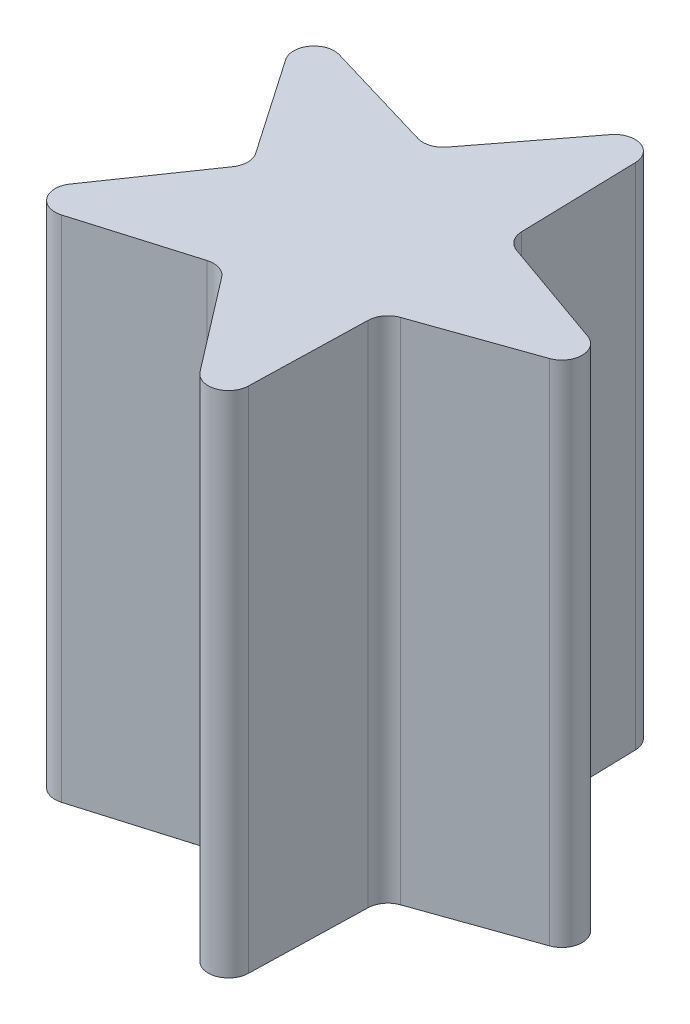
ISO-10303-21;
HEADER;
FILE_DESCRIPTION(('STEP AP214'),'2;1');
FILE_NAME('part.step','',(''),(''),'','','');
FILE_SCHEMA(('AUTOMOTIVE_DESIGN { 1 0 10303 214 1 1 1 1 }'));
ENDSEC;
DATA;
#1=APPLICATION_CONTEXT('core data for automotive mechanical design processes');
#2=APPLICATION_PROTOCOL_DEFINITION('international standard','automotive_design',2000,#1);
#3=PRODUCT_CONTEXT('',#1,'mechanical');
#4=PRODUCT('Part','Part','',(#3));
#5=PRODUCT_RELATED_PRODUCT_CATEGORY('part','',(#4));
#6=PRODUCT_DEFINITION_FORMATION('','',#4);
#7=PRODUCT_DEFINITION_CONTEXT('part definition',#1,'design');
#8=PRODUCT_DEFINITION('design','',#6,#7);
#9=PRODUCT_DEFINITION_SHAPE('','',#8);
#10=(LENGTH_UNIT() NAMED_UNIT(*) SI_UNIT(.MILLI.,.METRE.));
#11=(NAMED_UNIT(*) PLANE_ANGLE_UNIT() SI_UNIT($,.RADIAN.));
#12=(NAMED_UNIT(*) SI_UNIT($,.STERADIAN.) SOLID_ANGLE_UNIT());
#13=UNCERTAINTY_MEASURE_WITH_UNIT(LENGTH_MEASURE(1.E-05),#10,'distance_accuracy_value','');
#14=(GEOMETRIC_REPRESENTATION_CONTEXT(3) GLOBAL_UNCERTAINTY_ASSIGNED_CONTEXT((#13)) GLOBAL_UNIT_ASSIGNED_CONTEXT((#10,
#11,#12)) REPRESENTATION_CONTEXT('',''));
#15=CARTESIAN_POINT('',(0.,0.,0.));
#16=DIRECTION('',(0.,0.,1.));
#17=DIRECTION('',(1.,0.,0.));
#18=AXIS2_PLACEMENT_3D('',#15,#16,#17);
#19=CARTESIAN_POINT('',(-11.3879299942727,-0.000100076,-7.83707047785417));
#20=DIRECTION('',(0.823776107851996,0.,0.566915270681798));
#21=DIRECTION('',(0.566915270681798,0.,-0.823776107851996));
#22=AXIS2_PLACEMENT_3D('',#19,#20,#21);
#23=PLANE('',#22);
#24=DIRECTION('',(0.566915270681798,0.,-0.823776107851996));
#25=VECTOR('',#24,1.);
#26=CARTESIAN_POINT('',(-11.3879299942727,-0.000100076,-7.83707047785417));
#27=LINE('',#26,#25);
#28=CARTESIAN_POINT('',(-26.0389075690663,-0.000100076,13.4520460920266));
#29=VERTEX_POINT('',#28);
#30=CARTESIAN_POINT('',(-17.7723018016981,-0.000100076,1.43996478753178));
#31=VERTEX_POINT('',#30);
#32=EDGE_CURVE('E202',#29,#31,#27,.T.);
#33=ORIENTED_EDGE('',*,*,#32,.F.);
#34=DIRECTION('',(0.,1.,0.));
#35=VECTOR('',#34,1.);
#36=CARTESIAN_POINT('',(-26.0389075690663,-0.000100076,13.4520460920266));
#37=LINE('',#36,#35);
#38=CARTESIAN_POINT('',(-26.0389075690663,63.5,13.4520460920266));
#39=VERTEX_POINT('',#38);
#40=EDGE_CURVE('E186',#29,#39,#37,.T.);
#41=ORIENTED_EDGE('',*,*,#40,.T.);
#42=DIRECTION('',(0.566915270681798,0.,-0.823776107851996));
#43=VECTOR('',#42,1.);
#44=CARTESIAN_POINT('',(-11.3879299942727,63.5,-7.83707047785417));
#45=LINE('',#44,#43);
#46=CARTESIAN_POINT('',(-17.7723018016981,63.5,1.43996478753178));
#47=VERTEX_POINT('',#46);
#48=EDGE_CURVE('E199',#39,#47,#45,.T.);
#49=ORIENTED_EDGE('',*,*,#48,.T.);
#50=DIRECTION('',(0.,1.,0.));
#51=VECTOR('',#50,1.);
#52=CARTESIAN_POINT('',(-17.7723018016981,-0.000100076,1.43996478753178));
#53=LINE('',#52,#51);
#54=EDGE_CURVE('E205',#47,#31,#53,.F.);
#55=ORIENTED_EDGE('',*,*,#54,.T.);
#56=EDGE_LOOP('',(#33,#41,#49,#55));
#57=FACE_BOUND('',#56,.T.);
#58=ADVANCED_FACE('F43',(#57),#23,.F.);
#59=CARTESIAN_POINT('',(-11.3879299942727,-0.000100076,7.83707047785419));
#60=DIRECTION('',(0.823776107851995,0.,-0.5669152706818));
#61=DIRECTION('',(-0.5669152706818,0.,-0.823776107851995));
#62=AXIS2_PLACEMENT_3D('',#59,#60,#61);
#63=PLANE('',#62);
#64=DIRECTION('',(-0.5669152706818,0.,-0.823776107851995));
#65=VECTOR('',#64,1.);
#66=CARTESIAN_POINT('',(-11.3879299942727,-0.000100076,7.83707047785419));
#67=LINE('',#66,#65);
#68=CARTESIAN_POINT('',(-17.7723018016981,-0.000100076,-1.43996478753176));
#69=VERTEX_POINT('',#68);
#70=CARTESIAN_POINT('',(-26.0389075690663,-0.000100076,-13.4520460920265));
#71=VERTEX_POINT('',#70);
#72=EDGE_CURVE('E279',#69,#71,#67,.T.);
#73=ORIENTED_EDGE('',*,*,#72,.F.);
#74=DIRECTION('',(0.,1.,0.));
#75=VECTOR('',#74,1.);
#76=CARTESIAN_POINT('',(-17.7723018016981,63.5,-1.43996478753176));
#77=LINE('',#76,#75);
#78=CARTESIAN_POINT('',(-17.7723018016981,63.5,-1.43996478753176));
#79=VERTEX_POINT('',#78);
#80=EDGE_CURVE('E317',#69,#79,#77,.T.);
#81=ORIENTED_EDGE('',*,*,#80,.T.);
#82=DIRECTION('',(-0.5669152706818,0.,-0.823776107851995));
#83=VECTOR('',#82,1.);
#84=CARTESIAN_POINT('',(-11.3879299942727,63.5,7.83707047785419));
#85=LINE('',#84,#83);
#86=CARTESIAN_POINT('',(-26.0389075690663,63.5,-13.4520460920265));
#87=VERTEX_POINT('',#86);
#88=EDGE_CURVE('E243',#79,#87,#85,.T.);
#89=ORIENTED_EDGE('',*,*,#88,.T.);
#90=DIRECTION('',(0.,1.,0.));
#91=VECTOR('',#90,1.);
#92=CARTESIAN_POINT('',(-26.0389075690663,-0.000100076,-13.4520460920266));
#93=LINE('',#92,#91);
#94=EDGE_CURVE('E314',#87,#71,#93,.F.);
#95=ORIENTED_EDGE('',*,*,#94,.T.);
#96=EDGE_LOOP('',(#73,#81,#89,#95));
#97=FACE_BOUND('',#96,.T.);
#98=ADVANCED_FACE('F425',(#97),#63,.F.);
#99=CARTESIAN_POINT('',(2.8462974767085,-0.000100076,-9.58718535164249));
#100=DIRECTION('',(-0.284607645482839,0.,0.958644088352249));
#101=DIRECTION('',(0.958644088352249,0.,0.284607645482839));
#102=AXIS2_PLACEMENT_3D('',#99,#100,#101);
#103=PLANE('',#102);
#104=DIRECTION('',(0.958644088352249,0.,0.284607645482839));
#105=VECTOR('',#104,1.);
#106=CARTESIAN_POINT('',(2.8462974767085,-0.000100076,-9.58718535164249));
#107=LINE('',#106,#105);
#108=CARTESIAN_POINT('',(-23.2236128355958,-0.000100076,-17.326966863973));
#109=VERTEX_POINT('',#108);
#110=CARTESIAN_POINT('',(-9.24492296877413,-0.000100076,-13.1768948421769));
#111=VERTEX_POINT('',#110);
#112=EDGE_CURVE('E275',#109,#111,#107,.T.);
#113=ORIENTED_EDGE('',*,*,#112,.F.);
#114=DIRECTION('',(0.,1.,0.));
#115=VECTOR('',#114,1.);
#116=CARTESIAN_POINT('',(-23.2236128355958,-0.000100076,-17.326966863973));
#117=LINE('',#116,#115);
#118=CARTESIAN_POINT('',(-23.2236128355958,63.5,-17.326966863973));
#119=VERTEX_POINT('',#118);
#120=EDGE_CURVE('E324',#109,#119,#117,.T.);
#121=ORIENTED_EDGE('',*,*,#120,.T.);
#122=DIRECTION('',(0.958644088352249,0.,0.284607645482839));
#123=VECTOR('',#122,1.);
#124=CARTESIAN_POINT('',(2.8462974767085,63.5,-9.58718535164249));
#125=LINE('',#124,#123);
#126=CARTESIAN_POINT('',(-9.24492296877413,63.5,-13.1768948421769));
#127=VERTEX_POINT('',#126);
#128=EDGE_CURVE('E239',#119,#127,#125,.T.);
#129=ORIENTED_EDGE('',*,*,#128,.T.);
#130=DIRECTION('',(0.,1.,0.));
#131=VECTOR('',#130,1.);
#132=CARTESIAN_POINT('',(-9.24492296877413,-0.000100076,-13.1768948421769));
#133=LINE('',#132,#131);
#134=EDGE_CURVE('E321',#127,#111,#133,.F.);
#135=ORIENTED_EDGE('',*,*,#134,.T.);
#136=EDGE_LOOP('',(#113,#121,#129,#135));
#137=FACE_BOUND('',#136,.T.);
#138=ADVANCED_FACE('F434',(#137),#103,.F.);
#139=CARTESIAN_POINT('',(-10.8902954227724,-0.000100076,-8.34573329453274));
#140=DIRECTION('',(0.793729279255473,0.,0.608271182329549));
#141=DIRECTION('',(0.608271182329549,0.,-0.793729279255473));
#142=AXIS2_PLACEMENT_3D('',#139,#140,#141);
#143=PLANE('',#142);
#144=DIRECTION('',(0.608271182329549,0.,-0.793729279255473));
#145=VECTOR('',#144,1.);
#146=CARTESIAN_POINT('',(-10.8902954227724,-0.000100076,-8.34573329453274));
#147=LINE('',#146,#145);
#148=CARTESIAN_POINT('',(-6.50594717993881,-0.000100076,-14.0668420234745));
#149=VERTEX_POINT('',#148);
#150=CARTESIAN_POINT('',(2.36369935105341,-0.000100076,-25.6407885670757));
#151=VERTEX_POINT('',#150);
#152=EDGE_CURVE('E271',#149,#151,#147,.T.);
#153=ORIENTED_EDGE('',*,*,#152,.F.);
#154=DIRECTION('',(0.,1.,0.));
#155=VECTOR('',#154,1.);
#156=CARTESIAN_POINT('',(-6.50594717993881,63.5,-14.0668420234745));
#157=LINE('',#156,#155);
#158=CARTESIAN_POINT('',(-6.50594717993881,63.5,-14.0668420234745));
#159=VERTEX_POINT('',#158);
#160=EDGE_CURVE('E331',#149,#159,#157,.T.);
#161=ORIENTED_EDGE('',*,*,#160,.T.);
#162=DIRECTION('',(0.608271182329549,0.,-0.793729279255473));
#163=VECTOR('',#162,1.);
#164=CARTESIAN_POINT('',(-10.8902954227724,63.5,-8.34573329453274));
#165=LINE('',#164,#163);
#166=CARTESIAN_POINT('',(2.36369935105341,63.5,-25.6407885670757));
#167=VERTEX_POINT('',#166);
#168=EDGE_CURVE('E235',#159,#167,#165,.T.);
#169=ORIENTED_EDGE('',*,*,#168,.T.);
#170=DIRECTION('',(0.,1.,0.));
#171=VECTOR('',#170,1.);
#172=CARTESIAN_POINT('',(2.36369935105341,-0.000100076,-25.6407885670757));
#173=LINE('',#172,#171);
#174=EDGE_CURVE('E328',#167,#151,#173,.F.);
#175=ORIENTED_EDGE('',*,*,#174,.T.);
#176=EDGE_LOOP('',(#153,#161,#169,#175));
#177=FACE_BOUND('',#176,.T.);
#178=ADVANCED_FACE('F443',(#177),#143,.F.);
#179=CARTESIAN_POINT('',(7.53175218164962,-0.000100076,-0.192569669479797));
#180=DIRECTION('',(-0.999673306218471,0.,0.0255593590340493));
#181=DIRECTION('',(0.0255593590340493,0.,0.999673306218471));
#182=AXIS2_PLACEMENT_3D('',#179,#180,#181);
#183=PLANE('',#182);
#184=DIRECTION('',(0.0255593590340493,0.,0.999673306218471));
#185=VECTOR('',#184,1.);
#186=CARTESIAN_POINT('',(7.53175218164962,-0.000100076,-0.192569669479797));
#187=LINE('',#186,#185);
#188=CARTESIAN_POINT('',(6.91894191815723,-0.000100076,-24.1607005359051));
#189=VERTEX_POINT('',#188);
#190=CARTESIAN_POINT('',(7.29164160667859,-0.000100076,-9.58373366618029));
#191=VERTEX_POINT('',#190);
#192=EDGE_CURVE('E267',#189,#191,#187,.T.);
#193=ORIENTED_EDGE('',*,*,#192,.F.);
#194=DIRECTION('',(0.,1.,0.));
#195=VECTOR('',#194,1.);
#196=CARTESIAN_POINT('',(6.91894191815723,-0.000100076,-24.1607005359051));
#197=LINE('',#196,#195);
#198=CARTESIAN_POINT('',(6.91894191815723,63.5,-24.1607005359051));
#199=VERTEX_POINT('',#198);
#200=EDGE_CURVE('E338',#189,#199,#197,.T.);
#201=ORIENTED_EDGE('',*,*,#200,.T.);
#202=DIRECTION('',(0.0255593590340493,0.,0.999673306218471));
#203=VECTOR('',#202,1.);
#204=CARTESIAN_POINT('',(7.53175218164962,63.5,-0.192569669479797));
#205=LINE('',#204,#203);
#206=CARTESIAN_POINT('',(7.29164160667859,63.5,-9.58373366618029));
#207=VERTEX_POINT('',#206);
#208=EDGE_CURVE('E231',#199,#207,#205,.T.);
#209=ORIENTED_EDGE('',*,*,#208,.T.);
#210=DIRECTION('',(0.,1.,0.));
#211=VECTOR('',#210,1.);
#212=CARTESIAN_POINT('',(7.29164160667859,-0.000100076,-9.58373366618029));
#213=LINE('',#212,#211);
#214=EDGE_CURVE('E335',#207,#191,#213,.F.);
#215=ORIENTED_EDGE('',*,*,#214,.T.);
#216=EDGE_LOOP('',(#193,#201,#209,#215));
#217=FACE_BOUND('',#216,.T.);
#218=ADVANCED_FACE('F452',(#217),#183,.F.);
#219=CARTESIAN_POINT('',(3.27662145609177,-0.000100076,-9.27109220444371));
#220=DIRECTION('',(0.333224435406156,0.,-0.942847535738546));
#221=DIRECTION('',(-0.942847535738546,0.,-0.333224435406156));
#222=AXIS2_PLACEMENT_3D('',#219,#220,#221);
#223=PLANE('',#222);
#224=DIRECTION('',(-0.942847535738546,0.,-0.333224435406156));
#225=VECTOR('',#224,1.);
#226=CARTESIAN_POINT('',(3.27662145609177,-0.000100076,-9.27109220444371));
#227=LINE('',#226,#225);
#228=CARTESIAN_POINT('',(22.7327705302609,-0.000100076,-2.39483274077593));
#229=VERTEX_POINT('',#228);
#230=CARTESIAN_POINT('',(8.98442173854187,-0.000100076,-7.25382169735087));
#231=VERTEX_POINT('',#230);
#232=EDGE_CURVE('E263',#229,#231,#227,.T.);
#233=ORIENTED_EDGE('',*,*,#232,.T.);
#234=DIRECTION('',(0.,1.,0.));
#235=VECTOR('',#234,1.);
#236=CARTESIAN_POINT('',(8.98442173854187,-0.000100076,-7.25382169735087));
#237=LINE('',#236,#235);
#238=CARTESIAN_POINT('',(8.98442173854187,63.5,-7.25382169735087));
#239=VERTEX_POINT('',#238);
#240=EDGE_CURVE('E345',#231,#239,#237,.T.);
#241=ORIENTED_EDGE('',*,*,#240,.T.);
#242=DIRECTION('',(-0.942847535738546,0.,-0.333224435406156));
#243=VECTOR('',#242,1.);
#244=CARTESIAN_POINT('',(3.27662145609177,63.5,-9.27109220444371));
#245=LINE('',#244,#243);
#246=CARTESIAN_POINT('',(22.7327705302609,63.5,-2.39483274077593));
#247=VERTEX_POINT('',#246);
#248=EDGE_CURVE('E227',#247,#239,#245,.T.);
#249=ORIENTED_EDGE('',*,*,#248,.F.);
#250=DIRECTION('',(0.,1.,0.));
#251=VECTOR('',#250,1.);
#252=CARTESIAN_POINT('',(22.7327705302609,-0.000100076,-2.39483274077593));
#253=LINE('',#252,#251);
#254=EDGE_CURVE('E342',#247,#229,#253,.F.);
#255=ORIENTED_EDGE('',*,*,#254,.T.);
#256=EDGE_LOOP('',(#233,#241,#249,#255));
#257=FACE_BOUND('',#256,.T.);
#258=ADVANCED_FACE('F461',(#257),#223,.T.);
#259=CARTESIAN_POINT('',(3.27662145609178,-0.000100076,9.27109220444369));
#260=DIRECTION('',(-0.333224435406158,0.,-0.942847535738545));
#261=DIRECTION('',(-0.942847535738545,0.,0.333224435406158));
#262=AXIS2_PLACEMENT_3D('',#259,#260,#261);
#263=PLANE('',#262);
#264=DIRECTION('',(-0.942847535738545,0.,0.333224435406158));
#265=VECTOR('',#264,1.);
#266=CARTESIAN_POINT('',(3.27662145609178,-0.000100076,9.27109220444369));
#267=LINE('',#266,#265);
#268=CARTESIAN_POINT('',(22.7327705302609,-0.000100076,2.39483274077588));
#269=VERTEX_POINT('',#268);
#270=CARTESIAN_POINT('',(8.98442173854189,-0.000100076,7.25382169735084));
#271=VERTEX_POINT('',#270);
#272=EDGE_CURVE('E259',#269,#271,#267,.T.);
#273=ORIENTED_EDGE('',*,*,#272,.F.);
#274=DIRECTION('',(0.,1.,0.));
#275=VECTOR('',#274,1.);
#276=CARTESIAN_POINT('',(22.7327705302609,63.5,2.39483274077588));
#277=LINE('',#276,#275);
#278=CARTESIAN_POINT('',(22.7327705302609,63.5,2.39483274077588));
#279=VERTEX_POINT('',#278);
#280=EDGE_CURVE('E352',#269,#279,#277,.T.);
#281=ORIENTED_EDGE('',*,*,#280,.T.);
#282=DIRECTION('',(-0.942847535738545,0.,0.333224435406158));
#283=VECTOR('',#282,1.);
#284=CARTESIAN_POINT('',(3.27662145609178,63.5,9.27109220444369));
#285=LINE('',#284,#283);
#286=CARTESIAN_POINT('',(8.98442173854189,63.5,7.25382169735084));
#287=VERTEX_POINT('',#286);
#288=EDGE_CURVE('E223',#279,#287,#285,.T.);
#289=ORIENTED_EDGE('',*,*,#288,.T.);
#290=DIRECTION('',(0.,1.,0.));
#291=VECTOR('',#290,1.);
#292=CARTESIAN_POINT('',(8.98442173854189,-0.000100076,7.25382169735084));
#293=LINE('',#292,#291);
#294=EDGE_CURVE('E349',#287,#271,#293,.F.);
#295=ORIENTED_EDGE('',*,*,#294,.T.);
#296=EDGE_LOOP('',(#273,#281,#289,#295));
#297=FACE_BOUND('',#296,.T.);
#298=ADVANCED_FACE('F399',(#297),#263,.F.);
#299=CARTESIAN_POINT('',(7.53175218164961,-0.000100076,0.192569669479776));
#300=DIRECTION('',(-0.999673306218471,0.,-0.0255593590340466));
#301=DIRECTION('',(-0.0255593590340466,0.,0.999673306218471));
#302=AXIS2_PLACEMENT_3D('',#299,#300,#301);
#303=PLANE('',#302);
#304=DIRECTION('',(-0.0255593590340466,0.,0.999673306218471));
#305=VECTOR('',#304,1.);
#306=CARTESIAN_POINT('',(7.53175218164961,-0.000100076,0.192569669479776));
#307=LINE('',#306,#305);
#308=CARTESIAN_POINT('',(7.29164160667861,-0.000100076,9.58373366618026));
#309=VERTEX_POINT('',#308);
#310=CARTESIAN_POINT('',(6.91894191815729,-0.000100076,24.1607005359051));
#311=VERTEX_POINT('',#310);
#312=EDGE_CURVE('E256',#309,#311,#307,.T.);
#313=ORIENTED_EDGE('',*,*,#312,.F.);
#314=DIRECTION('',(0.,1.,0.));
#315=VECTOR('',#314,1.);
#316=CARTESIAN_POINT('',(7.29164160667861,63.5,9.58373366618026));
#317=LINE('',#316,#315);
#318=CARTESIAN_POINT('',(7.29164160667861,63.5,9.58373366618026));
#319=VERTEX_POINT('',#318);
#320=EDGE_CURVE('E365',#309,#319,#317,.T.);
#321=ORIENTED_EDGE('',*,*,#320,.T.);
#322=DIRECTION('',(-0.0255593590340466,0.,0.999673306218471));
#323=VECTOR('',#322,1.);
#324=CARTESIAN_POINT('',(7.53175218164961,63.5,0.192569669479776));
#325=LINE('',#324,#323);
#326=CARTESIAN_POINT('',(6.91894191815729,63.5,24.1607005359051));
#327=VERTEX_POINT('',#326);
#328=EDGE_CURVE('E219',#319,#327,#325,.T.);
#329=ORIENTED_EDGE('',*,*,#328,.T.);
#330=DIRECTION('',(0.,1.,0.));
#331=VECTOR('',#330,1.);
#332=CARTESIAN_POINT('',(6.91894191815729,-0.000100076,24.1607005359051));
#333=LINE('',#332,#331);
#334=EDGE_CURVE('E362',#327,#311,#333,.F.);
#335=ORIENTED_EDGE('',*,*,#334,.T.);
#336=EDGE_LOOP('',(#313,#321,#329,#335));
#337=FACE_BOUND('',#336,.T.);
#338=ADVANCED_FACE('F406',(#337),#303,.F.);
#339=CARTESIAN_POINT('',(-10.8902954227724,-0.000100076,8.34573329453276));
#340=DIRECTION('',(0.793729279255471,0.,-0.608271182329551));
#341=DIRECTION('',(-0.608271182329551,0.,-0.793729279255472));
#342=AXIS2_PLACEMENT_3D('',#339,#340,#341);
#343=PLANE('',#342);
#344=DIRECTION('',(-0.608271182329551,0.,-0.793729279255472));
#345=VECTOR('',#344,1.);
#346=CARTESIAN_POINT('',(-10.8902954227724,63.5,8.34573329453276));
#347=LINE('',#346,#345);
#348=CARTESIAN_POINT('',(2.36369935105349,63.5,25.6407885670757));
#349=VERTEX_POINT('',#348);
#350=CARTESIAN_POINT('',(-6.50594717993878,63.5,14.0668420234746));
#351=VERTEX_POINT('',#350);
#352=EDGE_CURVE('E214',#349,#351,#347,.T.);
#353=ORIENTED_EDGE('',*,*,#352,.T.);
#354=DIRECTION('',(0.,1.,0.));
#355=VECTOR('',#354,1.);
#356=CARTESIAN_POINT('',(-6.50594717993878,-0.000100076,14.0668420234746));
#357=LINE('',#356,#355);
#358=CARTESIAN_POINT('',(-6.50594717993878,-0.000100076,14.0668420234746));
#359=VERTEX_POINT('',#358);
#360=EDGE_CURVE('E59',#351,#359,#357,.F.);
#361=ORIENTED_EDGE('',*,*,#360,.T.);
#362=DIRECTION('',(-0.608271182329551,0.,-0.793729279255472));
#363=VECTOR('',#362,1.);
#364=CARTESIAN_POINT('',(-10.8902954227724,-0.000100076,8.34573329453276));
#365=LINE('',#364,#363);
#366=CARTESIAN_POINT('',(2.36369935105349,-0.000100076,25.6407885670757));
#367=VERTEX_POINT('',#366);
#368=EDGE_CURVE('E253',#367,#359,#365,.T.);
#369=ORIENTED_EDGE('',*,*,#368,.F.);
#370=DIRECTION('',(0.,1.,0.));
#371=VECTOR('',#370,1.);
#372=CARTESIAN_POINT('',(2.36369935105348,-0.000100076,25.6407885670757));
#373=LINE('',#372,#371);
#374=EDGE_CURVE('E356',#367,#349,#373,.T.);
#375=ORIENTED_EDGE('',*,*,#374,.T.);
#376=EDGE_LOOP('',(#353,#361,#369,#375));
#377=FACE_BOUND('',#376,.T.);
#378=ADVANCED_FACE('F411',(#377),#343,.F.);
#379=CARTESIAN_POINT('',(2.84629747670852,-0.000100076,9.58718535164248));
#380=DIRECTION('',(-0.284607645482841,0.,-0.958644088352249));
#381=DIRECTION('',(-0.958644088352249,0.,0.284607645482841));
#382=AXIS2_PLACEMENT_3D('',#379,#380,#381);
#383=PLANE('',#382);
#384=DIRECTION('',(-0.958644088352249,0.,0.284607645482841));
#385=VECTOR('',#384,1.);
#386=CARTESIAN_POINT('',(2.84629747670852,63.5,9.58718535164248));
#387=LINE('',#386,#385);
#388=CARTESIAN_POINT('',(-9.24492296877409,63.5,13.1768948421769));
#389=VERTEX_POINT('',#388);
#390=CARTESIAN_POINT('',(-23.2236128355958,63.5,17.3269668639731));
#391=VERTEX_POINT('',#390);
#392=EDGE_CURVE('E211',#389,#391,#387,.T.);
#393=ORIENTED_EDGE('',*,*,#392,.T.);
#394=DIRECTION('',(0.,1.,0.));
#395=VECTOR('',#394,1.);
#396=CARTESIAN_POINT('',(-23.2236128355958,-0.000100076,17.3269668639731));
#397=LINE('',#396,#395);
#398=CARTESIAN_POINT('',(-23.2236128355958,-0.000100076,17.3269668639731));
#399=VERTEX_POINT('',#398);
#400=EDGE_CURVE('E187',#391,#399,#397,.F.);
#401=ORIENTED_EDGE('',*,*,#400,.T.);
#402=DIRECTION('',(-0.958644088352249,0.,0.284607645482841));
#403=VECTOR('',#402,1.);
#404=CARTESIAN_POINT('',(2.84629747670852,-0.000100076,9.58718535164248));
#405=LINE('',#404,#403);
#406=CARTESIAN_POINT('',(-9.24492296877409,-0.000100076,13.1768948421769));
#407=VERTEX_POINT('',#406);
#408=EDGE_CURVE('E249',#407,#399,#405,.T.);
#409=ORIENTED_EDGE('',*,*,#408,.F.);
#410=DIRECTION('',(0.,1.,0.));
#411=VECTOR('',#410,1.);
#412=CARTESIAN_POINT('',(-9.24492296877409,63.5,13.1768948421769));
#413=LINE('',#412,#411);
#414=EDGE_CURVE('E193',#407,#389,#413,.T.);
#415=ORIENTED_EDGE('',*,*,#414,.T.);
#416=EDGE_LOOP('',(#393,#401,#409,#415));
#417=FACE_BOUND('',#416,.T.);
#418=ADVANCED_FACE('F418',(#417),#383,.F.);
#419=CARTESIAN_POINT('',(0.,-0.000100076,0.));
#420=DIRECTION('',(0.,1.,0.));
#421=DIRECTION('',(0.,0.,1.));
#422=AXIS2_PLACEMENT_3D('',#419,#420,#421);
#423=PLANE('',#422);
#424=ORIENTED_EDGE('',*,*,#408,.T.);
#425=CARTESIAN_POINT('',(-23.9465162551222,-0.000100076,14.8920108795584));
#426=DIRECTION('',(0.,1.,0.));
#427=DIRECTION('',(0.,0.,1.));
#428=AXIS2_PLACEMENT_3D('',#425,#426,#427);
#429=CIRCLE('',#428,2.54);
#430=EDGE_CURVE('E311',#399,#29,#429,.F.);
#431=ORIENTED_EDGE('',*,*,#430,.T.);
#432=ORIENTED_EDGE('',*,*,#32,.T.);
#433=CARTESIAN_POINT('',(-19.8646931156421,-0.000100076,0.));
#434=DIRECTION('',(0.,1.,0.));
#435=DIRECTION('',(0.,0.,1.));
#436=AXIS2_PLACEMENT_3D('',#433,#434,#435);
#437=CIRCLE('',#436,2.54);
#438=EDGE_CURVE('E371',#31,#69,#437,.T.);
#439=ORIENTED_EDGE('',*,*,#438,.T.);
#440=ORIENTED_EDGE('',*,*,#72,.T.);
#441=CARTESIAN_POINT('',(-23.9465162551222,-0.000100076,-14.8920108795583));
#442=DIRECTION('',(0.,1.,0.));
#443=DIRECTION('',(0.,0.,1.));
#444=AXIS2_PLACEMENT_3D('',#441,#442,#443);
#445=CIRCLE('',#444,2.54);
#446=EDGE_CURVE('E308',#71,#109,#445,.F.);
#447=ORIENTED_EDGE('',*,*,#446,.T.);
#448=ORIENTED_EDGE('',*,*,#112,.T.);
#449=CARTESIAN_POINT('',(-8.52201954924772,-0.000100076,-15.6118508265916));
#450=DIRECTION('',(0.,1.,0.));
#451=DIRECTION('',(0.,0.,1.));
#452=AXIS2_PLACEMENT_3D('',#449,#450,#451);
#453=CIRCLE('',#452,2.54);
#454=EDGE_CURVE('E377',#111,#149,#453,.T.);
#455=ORIENTED_EDGE('',*,*,#454,.T.);
#456=ORIENTED_EDGE('',*,*,#152,.T.);
#457=CARTESIAN_POINT('',(4.37977172036232,-0.000100076,-24.0957797639586));
#458=DIRECTION('',(0.,1.,0.));
#459=DIRECTION('',(0.,0.,1.));
#460=AXIS2_PLACEMENT_3D('',#457,#458,#459);
#461=CIRCLE('',#460,2.54);
#462=EDGE_CURVE('E305',#151,#189,#461,.F.);
#463=ORIENTED_EDGE('',*,*,#462,.T.);
#464=ORIENTED_EDGE('',*,*,#192,.T.);
#465=CARTESIAN_POINT('',(9.8308118044735,-0.000100076,-9.64865443812677));
#466=DIRECTION('',(0.,1.,0.));
#467=DIRECTION('',(0.,0.,1.));
#468=AXIS2_PLACEMENT_3D('',#465,#466,#467);
#469=CIRCLE('',#468,2.54);
#470=EDGE_CURVE('E383',#191,#231,#469,.T.);
#471=ORIENTED_EDGE('',*,*,#470,.T.);
#472=ORIENTED_EDGE('',*,*,#232,.F.);
#473=CARTESIAN_POINT('',(21.8863804643293,-0.000100076,0.));
#474=DIRECTION('',(0.,1.,0.));
#475=DIRECTION('',(0.,0.,1.));
#476=AXIS2_PLACEMENT_3D('',#473,#474,#475);
#477=CIRCLE('',#476,2.54);
#478=EDGE_CURVE('E302',#229,#269,#477,.F.);
#479=ORIENTED_EDGE('',*,*,#478,.T.);
#480=ORIENTED_EDGE('',*,*,#272,.T.);
#481=CARTESIAN_POINT('',(9.83081180447353,-0.000100076,9.64865443812674));
#482=DIRECTION('',(0.,1.,0.));
#483=DIRECTION('',(0.,0.,1.));
#484=AXIS2_PLACEMENT_3D('',#481,#482,#483);
#485=CIRCLE('',#484,2.54);
#486=EDGE_CURVE('E11',#271,#309,#485,.T.);
#487=ORIENTED_EDGE('',*,*,#486,.T.);
#488=ORIENTED_EDGE('',*,*,#312,.T.);
#489=CARTESIAN_POINT('',(4.37977172036238,-0.000100076,24.0957797639586));
#490=DIRECTION('',(0.,1.,0.));
#491=DIRECTION('',(0.,0.,1.));
#492=AXIS2_PLACEMENT_3D('',#489,#490,#491);
#493=CIRCLE('',#492,2.54);
#494=EDGE_CURVE('E66',#311,#367,#493,.F.);
#495=ORIENTED_EDGE('',*,*,#494,.T.);
#496=ORIENTED_EDGE('',*,*,#368,.T.);
#497=CARTESIAN_POINT('',(-8.52201954924768,-0.000100076,15.6118508265916));
#498=DIRECTION('',(0.,1.,0.));
#499=DIRECTION('',(0.,0.,1.));
#500=AXIS2_PLACEMENT_3D('',#497,#498,#499);
#501=CIRCLE('',#500,2.54);
#502=EDGE_CURVE('E389',#359,#407,#501,.T.);
#503=ORIENTED_EDGE('',*,*,#502,.T.);
#504=EDGE_LOOP('',(#424,#431,#432,#439,#440,#447,#448,#455,#456,#463,#464,#471,#472,#479,#480,
#487,#488,#495,#496,#503));
#505=FACE_BOUND('',#504,.T.);
#506=ADVANCED_FACE('F404',(#505),#423,.F.);
#507=CARTESIAN_POINT('',(0.,63.5,0.));
#508=DIRECTION('',(0.,1.,0.));
#509=DIRECTION('',(0.,0.,1.));
#510=AXIS2_PLACEMENT_3D('',#507,#508,#509);
#511=PLANE('',#510);
#512=ORIENTED_EDGE('',*,*,#48,.F.);
#513=CARTESIAN_POINT('',(-23.9465162551222,63.5,14.8920108795584));
#514=DIRECTION('',(0.,1.,0.));
#515=DIRECTION('',(0.,0.,1.));
#516=AXIS2_PLACEMENT_3D('',#513,#514,#515);
#517=CIRCLE('',#516,2.54);
#518=EDGE_CURVE('E182',#39,#391,#517,.T.);
#519=ORIENTED_EDGE('',*,*,#518,.T.);
#520=ORIENTED_EDGE('',*,*,#392,.F.);
#521=CARTESIAN_POINT('',(-8.52201954924768,63.5,15.6118508265916));
#522=DIRECTION('',(0.,1.,0.));
#523=DIRECTION('',(0.,0.,1.));
#524=AXIS2_PLACEMENT_3D('',#521,#522,#523);
#525=CIRCLE('',#524,2.54);
#526=EDGE_CURVE('E386',#389,#351,#525,.F.);
#527=ORIENTED_EDGE('',*,*,#526,.T.);
#528=ORIENTED_EDGE('',*,*,#352,.F.);
#529=CARTESIAN_POINT('',(4.37977172036238,63.5,24.0957797639586));
#530=DIRECTION('',(0.,1.,0.));
#531=DIRECTION('',(0.,0.,1.));
#532=AXIS2_PLACEMENT_3D('',#529,#530,#531);
#533=CIRCLE('',#532,2.54);
#534=EDGE_CURVE('E204',#349,#327,#533,.T.);
#535=ORIENTED_EDGE('',*,*,#534,.T.);
#536=ORIENTED_EDGE('',*,*,#328,.F.);
#537=CARTESIAN_POINT('',(9.83081180447353,63.5,9.64865443812674));
#538=DIRECTION('',(0.,1.,0.));
#539=DIRECTION('',(0.,0.,1.));
#540=AXIS2_PLACEMENT_3D('',#537,#538,#539);
#541=CIRCLE('',#540,2.54);
#542=EDGE_CURVE('E52',#319,#287,#541,.F.);
#543=ORIENTED_EDGE('',*,*,#542,.T.);
#544=ORIENTED_EDGE('',*,*,#288,.F.);
#545=CARTESIAN_POINT('',(21.8863804643293,63.5,0.));
#546=DIRECTION('',(0.,1.,0.));
#547=DIRECTION('',(0.,0.,1.));
#548=AXIS2_PLACEMENT_3D('',#545,#546,#547);
#549=CIRCLE('',#548,2.54);
#550=EDGE_CURVE('E287',#279,#247,#549,.T.);
#551=ORIENTED_EDGE('',*,*,#550,.T.);
#552=ORIENTED_EDGE('',*,*,#248,.T.);
#553=CARTESIAN_POINT('',(9.8308118044735,63.5,-9.64865443812677));
#554=DIRECTION('',(0.,1.,0.));
#555=DIRECTION('',(0.,0.,1.));
#556=AXIS2_PLACEMENT_3D('',#553,#554,#555);
#557=CIRCLE('',#556,2.54);
#558=EDGE_CURVE('E380',#239,#207,#557,.F.);
#559=ORIENTED_EDGE('',*,*,#558,.T.);
#560=ORIENTED_EDGE('',*,*,#208,.F.);
#561=CARTESIAN_POINT('',(4.37977172036232,63.5,-24.0957797639586));
#562=DIRECTION('',(0.,1.,0.));
#563=DIRECTION('',(0.,0.,1.));
#564=AXIS2_PLACEMENT_3D('',#561,#562,#563);
#565=CIRCLE('',#564,2.54);
#566=EDGE_CURVE('E290',#199,#167,#565,.T.);
#567=ORIENTED_EDGE('',*,*,#566,.T.);
#568=ORIENTED_EDGE('',*,*,#168,.F.);
#569=CARTESIAN_POINT('',(-8.52201954924772,63.5,-15.6118508265916));
#570=DIRECTION('',(0.,1.,0.));
#571=DIRECTION('',(0.,0.,1.));
#572=AXIS2_PLACEMENT_3D('',#569,#570,#571);
#573=CIRCLE('',#572,2.54);
#574=EDGE_CURVE('E374',#159,#127,#573,.F.);
#575=ORIENTED_EDGE('',*,*,#574,.T.);
#576=ORIENTED_EDGE('',*,*,#128,.F.);
#577=CARTESIAN_POINT('',(-23.9465162551222,63.5,-14.8920108795583));
#578=DIRECTION('',(0.,1.,0.));
#579=DIRECTION('',(0.,0.,1.));
#580=AXIS2_PLACEMENT_3D('',#577,#578,#579);
#581=CIRCLE('',#580,2.54);
#582=EDGE_CURVE('E194',#119,#87,#581,.T.);
#583=ORIENTED_EDGE('',*,*,#582,.T.);
#584=ORIENTED_EDGE('',*,*,#88,.F.);
#585=CARTESIAN_POINT('',(-19.8646931156421,63.5,0.));
#586=DIRECTION('',(0.,1.,0.));
#587=DIRECTION('',(0.,0.,1.));
#588=AXIS2_PLACEMENT_3D('',#585,#586,#587);
#589=CIRCLE('',#588,2.54);
#590=EDGE_CURVE('E209',#79,#47,#589,.F.);
#591=ORIENTED_EDGE('',*,*,#590,.T.);
#592=EDGE_LOOP('',(#512,#519,#520,#527,#528,#535,#536,#543,#544,#551,#552,#559,#560,#567,#568,
#575,#576,#583,#584,#591));
#593=FACE_BOUND('',#592,.T.);
#594=ADVANCED_FACE('F207',(#593),#511,.T.);
#595=CARTESIAN_POINT('',(-23.9465162551222,-0.000100076,14.8920108795584));
#596=DIRECTION('',(0.,1.,0.));
#597=DIRECTION('',(0.,0.,1.));
#598=AXIS2_PLACEMENT_3D('',#595,#596,#597);
#599=CYLINDRICAL_SURFACE('',#598,2.54);
#600=ORIENTED_EDGE('',*,*,#430,.F.);
#601=ORIENTED_EDGE('',*,*,#400,.F.);
#602=ORIENTED_EDGE('',*,*,#518,.F.);
#603=ORIENTED_EDGE('',*,*,#40,.F.);
#604=EDGE_LOOP('',(#600,#601,#602,#603));
#605=FACE_BOUND('',#604,.T.);
#606=ADVANCED_FACE('F185',(#605),#599,.T.);
#607=CARTESIAN_POINT('',(-19.8646931156421,-0.000100076,0.));
#608=DIRECTION('',(0.,-1.,0.));
#609=DIRECTION('',(0.,0.,-1.));
#610=AXIS2_PLACEMENT_3D('',#607,#608,#609);
#611=CYLINDRICAL_SURFACE('',#610,2.54);
#612=ORIENTED_EDGE('',*,*,#438,.F.);
#613=ORIENTED_EDGE('',*,*,#54,.F.);
#614=ORIENTED_EDGE('',*,*,#590,.F.);
#615=ORIENTED_EDGE('',*,*,#80,.F.);
#616=EDGE_LOOP('',(#612,#613,#614,#615));
#617=FACE_BOUND('',#616,.T.);
#618=ADVANCED_FACE('F423',(#617),#611,.F.);
#619=CARTESIAN_POINT('',(-23.9465162551222,-0.000100076,-14.8920108795583));
#620=DIRECTION('',(0.,1.,0.));
#621=DIRECTION('',(0.,0.,1.));
#622=AXIS2_PLACEMENT_3D('',#619,#620,#621);
#623=CYLINDRICAL_SURFACE('',#622,2.54);
#624=ORIENTED_EDGE('',*,*,#446,.F.);
#625=ORIENTED_EDGE('',*,*,#94,.F.);
#626=ORIENTED_EDGE('',*,*,#582,.F.);
#627=ORIENTED_EDGE('',*,*,#120,.F.);
#628=EDGE_LOOP('',(#624,#625,#626,#627));
#629=FACE_BOUND('',#628,.T.);
#630=ADVANCED_FACE('F431',(#629),#623,.T.);
#631=CARTESIAN_POINT('',(-8.52201954924772,-0.000100076,-15.6118508265916));
#632=DIRECTION('',(0.,-1.,0.));
#633=DIRECTION('',(0.,0.,-1.));
#634=AXIS2_PLACEMENT_3D('',#631,#632,#633);
#635=CYLINDRICAL_SURFACE('',#634,2.54);
#636=ORIENTED_EDGE('',*,*,#454,.F.);
#637=ORIENTED_EDGE('',*,*,#134,.F.);
#638=ORIENTED_EDGE('',*,*,#574,.F.);
#639=ORIENTED_EDGE('',*,*,#160,.F.);
#640=EDGE_LOOP('',(#636,#637,#638,#639));
#641=FACE_BOUND('',#640,.T.);
#642=ADVANCED_FACE('F440',(#641),#635,.F.);
#643=CARTESIAN_POINT('',(4.37977172036232,-0.000100076,-24.0957797639586));
#644=DIRECTION('',(0.,1.,0.));
#645=DIRECTION('',(0.,0.,1.));
#646=AXIS2_PLACEMENT_3D('',#643,#644,#645);
#647=CYLINDRICAL_SURFACE('',#646,2.54);
#648=ORIENTED_EDGE('',*,*,#462,.F.);
#649=ORIENTED_EDGE('',*,*,#174,.F.);
#650=ORIENTED_EDGE('',*,*,#566,.F.);
#651=ORIENTED_EDGE('',*,*,#200,.F.);
#652=EDGE_LOOP('',(#648,#649,#650,#651));
#653=FACE_BOUND('',#652,.T.);
#654=ADVANCED_FACE('F449',(#653),#647,.T.);
#655=CARTESIAN_POINT('',(9.8308118044735,-0.000100076,-9.64865443812677));
#656=DIRECTION('',(0.,1.,0.));
#657=DIRECTION('',(0.,0.,1.));
#658=AXIS2_PLACEMENT_3D('',#655,#656,#657);
#659=CYLINDRICAL_SURFACE('',#658,2.54);
#660=ORIENTED_EDGE('',*,*,#470,.F.);
#661=ORIENTED_EDGE('',*,*,#214,.F.);
#662=ORIENTED_EDGE('',*,*,#558,.F.);
#663=ORIENTED_EDGE('',*,*,#240,.F.);
#664=EDGE_LOOP('',(#660,#661,#662,#663));
#665=FACE_BOUND('',#664,.T.);
#666=ADVANCED_FACE('F458',(#665),#659,.F.);
#667=CARTESIAN_POINT('',(21.8863804643293,-0.000100076,0.));
#668=DIRECTION('',(0.,-1.,0.));
#669=DIRECTION('',(0.,0.,-1.));
#670=AXIS2_PLACEMENT_3D('',#667,#668,#669);
#671=CYLINDRICAL_SURFACE('',#670,2.54);
#672=ORIENTED_EDGE('',*,*,#478,.F.);
#673=ORIENTED_EDGE('',*,*,#254,.F.);
#674=ORIENTED_EDGE('',*,*,#550,.F.);
#675=ORIENTED_EDGE('',*,*,#280,.F.);
#676=EDGE_LOOP('',(#672,#673,#674,#675));
#677=FACE_BOUND('',#676,.T.);
#678=ADVANCED_FACE('F465',(#677),#671,.T.);
#679=CARTESIAN_POINT('',(-8.52201954924768,-0.000100076,15.6118508265916));
#680=DIRECTION('',(0.,-1.,0.));
#681=DIRECTION('',(0.,0.,-1.));
#682=AXIS2_PLACEMENT_3D('',#679,#680,#681);
#683=CYLINDRICAL_SURFACE('',#682,2.54);
#684=ORIENTED_EDGE('',*,*,#502,.F.);
#685=ORIENTED_EDGE('',*,*,#360,.F.);
#686=ORIENTED_EDGE('',*,*,#526,.F.);
#687=ORIENTED_EDGE('',*,*,#414,.F.);
#688=EDGE_LOOP('',(#684,#685,#686,#687));
#689=FACE_BOUND('',#688,.T.);
#690=ADVANCED_FACE('F415',(#689),#683,.F.);
#691=CARTESIAN_POINT('',(9.83081180447353,-0.000100076,9.64865443812674));
#692=DIRECTION('',(0.,-1.,0.));
#693=DIRECTION('',(0.,0.,-1.));
#694=AXIS2_PLACEMENT_3D('',#691,#692,#693);
#695=CYLINDRICAL_SURFACE('',#694,2.54);
#696=ORIENTED_EDGE('',*,*,#486,.F.);
#697=ORIENTED_EDGE('',*,*,#294,.F.);
#698=ORIENTED_EDGE('',*,*,#542,.F.);
#699=ORIENTED_EDGE('',*,*,#320,.F.);
#700=EDGE_LOOP('',(#696,#697,#698,#699));
#701=FACE_BOUND('',#700,.T.);
#702=ADVANCED_FACE('F402',(#701),#695,.F.);
#703=CARTESIAN_POINT('',(4.37977172036238,-0.000100076,24.0957797639586));
#704=DIRECTION('',(0.,1.,0.));
#705=DIRECTION('',(0.,0.,1.));
#706=AXIS2_PLACEMENT_3D('',#703,#704,#705);
#707=CYLINDRICAL_SURFACE('',#706,2.54);
#708=ORIENTED_EDGE('',*,*,#494,.F.);
#709=ORIENTED_EDGE('',*,*,#334,.F.);
#710=ORIENTED_EDGE('',*,*,#534,.F.);
#711=ORIENTED_EDGE('',*,*,#374,.F.);
#712=EDGE_LOOP('',(#708,#709,#710,#711));
#713=FACE_BOUND('',#712,.T.);
#714=ADVANCED_FACE('F45',(#713),#707,.T.);
#715=CLOSED_SHELL('',(#58,#98,#138,#178,#218,#258,#298,#338,#378,#418,#506,#594,#606,#618,#630,
#642,#654,#666,#678,#690,#702,#714));
#716=MANIFOLD_SOLID_BREP('B2',#715);
#717=ADVANCED_BREP_SHAPE_REPRESENTATION('',(#18,#716),#14);
#718=SHAPE_DEFINITION_REPRESENTATION(#9,#717);
ENDSEC;
END-ISO-10303-21;
